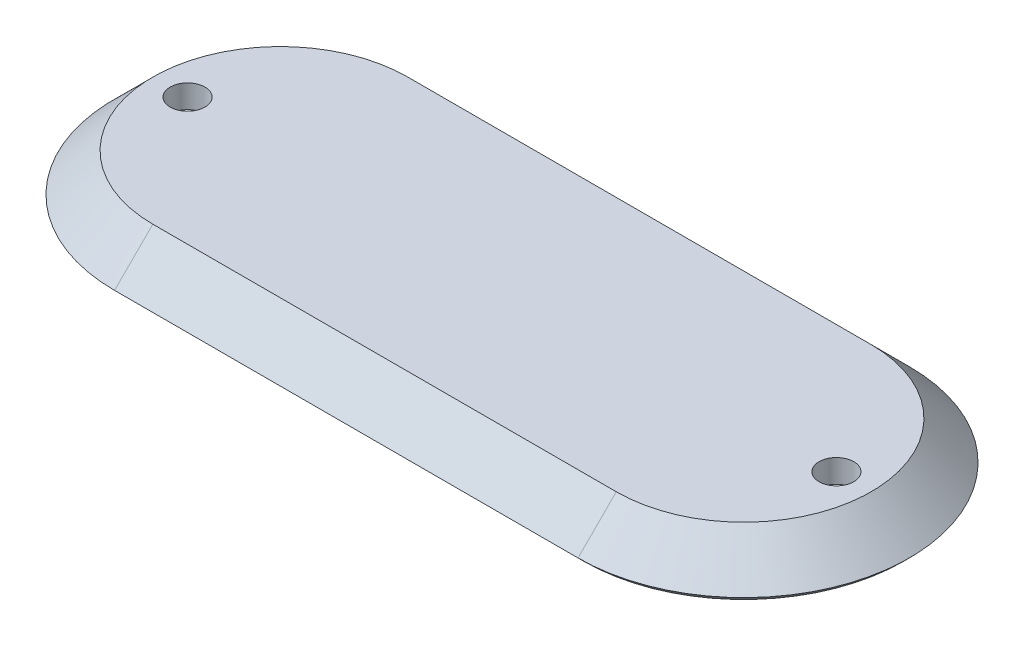
ISO-10303-21;
HEADER;
FILE_DESCRIPTION(('STEP AP214'),'2;1');
FILE_NAME('part.step','',(''),(''),'','','');
FILE_SCHEMA(('AUTOMOTIVE_DESIGN { 1 0 10303 214 1 1 1 1 }'));
ENDSEC;
DATA;
#1=APPLICATION_CONTEXT('core data for automotive mechanical design processes');
#2=APPLICATION_PROTOCOL_DEFINITION('international standard','automotive_design',2000,#1);
#3=PRODUCT_CONTEXT('',#1,'mechanical');
#4=PRODUCT('Part','Part','',(#3));
#5=PRODUCT_RELATED_PRODUCT_CATEGORY('part','',(#4));
#6=PRODUCT_DEFINITION_FORMATION('','',#4);
#7=PRODUCT_DEFINITION_CONTEXT('part definition',#1,'design');
#8=PRODUCT_DEFINITION('design','',#6,#7);
#9=PRODUCT_DEFINITION_SHAPE('','',#8);
#10=(LENGTH_UNIT() NAMED_UNIT(*) SI_UNIT(.MILLI.,.METRE.));
#11=(NAMED_UNIT(*) PLANE_ANGLE_UNIT() SI_UNIT($,.RADIAN.));
#12=(NAMED_UNIT(*) SI_UNIT($,.STERADIAN.) SOLID_ANGLE_UNIT());
#13=UNCERTAINTY_MEASURE_WITH_UNIT(LENGTH_MEASURE(1.E-05),#10,'distance_accuracy_value','');
#14=(GEOMETRIC_REPRESENTATION_CONTEXT(3) GLOBAL_UNCERTAINTY_ASSIGNED_CONTEXT((#13)) GLOBAL_UNIT_ASSIGNED_CONTEXT((#10,
#11,#12)) REPRESENTATION_CONTEXT('',''));
#15=CARTESIAN_POINT('',(0.,0.,0.));
#16=DIRECTION('',(0.,0.,1.));
#17=DIRECTION('',(1.,0.,0.));
#18=AXIS2_PLACEMENT_3D('',#15,#16,#17);
#19=CARTESIAN_POINT('',(-20.,0.,0.));
#20=DIRECTION('',(0.,-1.,0.));
#21=DIRECTION('',(0.,0.,1.));
#22=AXIS2_PLACEMENT_3D('',#19,#20,#21);
#23=CONICAL_SURFACE('',#22,14.8,0.78539816339745);
#24=DIRECTION('',(0.,-0.707106781186546,-0.707106781186549));
#25=VECTOR('',#24,1.);
#26=CARTESIAN_POINT('',(-20.,0.,-14.8));
#27=LINE('',#26,#25);
#28=CARTESIAN_POINT('',(-20.,3.8,-11.));
#29=VERTEX_POINT('',#28);
#30=CARTESIAN_POINT('',(-20.,0.500000000000007,-14.3));
#31=VERTEX_POINT('',#30);
#32=EDGE_CURVE('E166',#29,#31,#27,.T.);
#33=ORIENTED_EDGE('',*,*,#32,.T.);
#34=CARTESIAN_POINT('',(-20.,0.500000000000007,0.));
#35=DIRECTION('',(0.,1.,0.));
#36=DIRECTION('',(0.,0.,1.));
#37=AXIS2_PLACEMENT_3D('',#34,#35,#36);
#38=CIRCLE('',#37,14.3);
#39=CARTESIAN_POINT('',(-20.,0.500000000000011,14.3));
#40=VERTEX_POINT('',#39);
#41=EDGE_CURVE('E164',#31,#40,#38,.T.);
#42=ORIENTED_EDGE('',*,*,#41,.T.);
#43=DIRECTION('',(0.,-0.707106781186546,0.707106781186549));
#44=VECTOR('',#43,1.);
#45=CARTESIAN_POINT('',(-20.,0.,14.8));
#46=LINE('',#45,#44);
#47=CARTESIAN_POINT('',(-20.,3.8,11.));
#48=VERTEX_POINT('',#47);
#49=EDGE_CURVE('E162',#48,#40,#46,.T.);
#50=ORIENTED_EDGE('',*,*,#49,.F.);
#51=CARTESIAN_POINT('',(-20.,3.8,0.));
#52=DIRECTION('',(0.,1.,0.));
#53=DIRECTION('',(0.,0.,1.));
#54=AXIS2_PLACEMENT_3D('',#51,#52,#53);
#55=CIRCLE('',#54,11.);
#56=EDGE_CURVE('E137',#29,#48,#55,.T.);
#57=ORIENTED_EDGE('',*,*,#56,.F.);
#58=EDGE_LOOP('',(#33,#42,#50,#57));
#59=FACE_BOUND('',#58,.T.);
#60=ADVANCED_FACE('F33',(#59),#23,.T.);
#61=CARTESIAN_POINT('',(-20.,0.,14.8));
#62=DIRECTION('',(0.,0.707106781186549,0.707106781186546));
#63=DIRECTION('',(0.,-0.707106781186546,0.707106781186549));
#64=AXIS2_PLACEMENT_3D('',#61,#62,#63);
#65=PLANE('',#64);
#66=ORIENTED_EDGE('',*,*,#49,.T.);
#67=DIRECTION('',(-1.,0.,0.));
#68=VECTOR('',#67,1.);
#69=CARTESIAN_POINT('',(-20.,0.500000000000009,14.3));
#70=LINE('',#69,#68);
#71=CARTESIAN_POINT('',(20.,0.500000000000007,14.3));
#72=VERTEX_POINT('',#71);
#73=EDGE_CURVE('E56',#40,#72,#70,.F.);
#74=ORIENTED_EDGE('',*,*,#73,.T.);
#75=DIRECTION('',(0.,-0.707106781186546,0.707106781186549));
#76=VECTOR('',#75,1.);
#77=CARTESIAN_POINT('',(20.,0.,14.8));
#78=LINE('',#77,#76);
#79=CARTESIAN_POINT('',(20.,3.8,11.));
#80=VERTEX_POINT('',#79);
#81=EDGE_CURVE('E165',#80,#72,#78,.T.);
#82=ORIENTED_EDGE('',*,*,#81,.F.);
#83=DIRECTION('',(-1.,0.,0.));
#84=VECTOR('',#83,1.);
#85=CARTESIAN_POINT('',(-20.,3.8,11.));
#86=LINE('',#85,#84);
#87=EDGE_CURVE('E141',#48,#80,#86,.F.);
#88=ORIENTED_EDGE('',*,*,#87,.F.);
#89=EDGE_LOOP('',(#66,#74,#82,#88));
#90=FACE_BOUND('',#89,.T.);
#91=ADVANCED_FACE('F220',(#90),#65,.T.);
#92=CARTESIAN_POINT('',(20.,0.,0.));
#93=DIRECTION('',(0.,-1.,0.));
#94=DIRECTION('',(0.,0.,1.));
#95=AXIS2_PLACEMENT_3D('',#92,#93,#94);
#96=CONICAL_SURFACE('',#95,14.8,0.78539816339745);
#97=ORIENTED_EDGE('',*,*,#81,.T.);
#98=CARTESIAN_POINT('',(20.,0.500000000000007,0.));
#99=DIRECTION('',(0.,1.,0.));
#100=DIRECTION('',(0.,0.,1.));
#101=AXIS2_PLACEMENT_3D('',#98,#99,#100);
#102=CIRCLE('',#101,14.3);
#103=CARTESIAN_POINT('',(20.,0.500000000000007,-14.3));
#104=VERTEX_POINT('',#103);
#105=EDGE_CURVE('E11',#72,#104,#102,.T.);
#106=ORIENTED_EDGE('',*,*,#105,.T.);
#107=DIRECTION('',(0.,-0.707106781186546,-0.707106781186549));
#108=VECTOR('',#107,1.);
#109=CARTESIAN_POINT('',(20.,0.,-14.8));
#110=LINE('',#109,#108);
#111=CARTESIAN_POINT('',(20.,3.8,-11.));
#112=VERTEX_POINT('',#111);
#113=EDGE_CURVE('E169',#112,#104,#110,.T.);
#114=ORIENTED_EDGE('',*,*,#113,.F.);
#115=CARTESIAN_POINT('',(20.,3.8,0.));
#116=DIRECTION('',(0.,1.,0.));
#117=DIRECTION('',(0.,0.,1.));
#118=AXIS2_PLACEMENT_3D('',#115,#116,#117);
#119=CIRCLE('',#118,11.);
#120=EDGE_CURVE('E174',#80,#112,#119,.T.);
#121=ORIENTED_EDGE('',*,*,#120,.F.);
#122=EDGE_LOOP('',(#97,#106,#114,#121));
#123=FACE_BOUND('',#122,.T.);
#124=ADVANCED_FACE('F227',(#123),#96,.T.);
#125=CARTESIAN_POINT('',(-20.,0.,-14.8));
#126=DIRECTION('',(0.,0.707106781186549,-0.707106781186546));
#127=DIRECTION('',(0.,0.707106781186546,0.707106781186549));
#128=AXIS2_PLACEMENT_3D('',#125,#126,#127);
#129=PLANE('',#128);
#130=ORIENTED_EDGE('',*,*,#113,.T.);
#131=DIRECTION('',(1.,0.,0.));
#132=VECTOR('',#131,1.);
#133=CARTESIAN_POINT('',(-20.,0.500000000000009,-14.3));
#134=LINE('',#133,#132);
#135=EDGE_CURVE('E42',#104,#31,#134,.F.);
#136=ORIENTED_EDGE('',*,*,#135,.T.);
#137=ORIENTED_EDGE('',*,*,#32,.F.);
#138=DIRECTION('',(1.,0.,0.));
#139=VECTOR('',#138,1.);
#140=CARTESIAN_POINT('',(-20.,3.8,-11.));
#141=LINE('',#140,#139);
#142=EDGE_CURVE('E170',#112,#29,#141,.F.);
#143=ORIENTED_EDGE('',*,*,#142,.F.);
#144=EDGE_LOOP('',(#130,#136,#137,#143));
#145=FACE_BOUND('',#144,.T.);
#146=ADVANCED_FACE('F226',(#145),#129,.T.);
#147=CARTESIAN_POINT('',(-20.,3.8,0.));
#148=DIRECTION('',(0.,1.,0.));
#149=DIRECTION('',(0.,0.,1.));
#150=AXIS2_PLACEMENT_3D('',#147,#148,#149);
#151=PLANE('',#150);
#152=CARTESIAN_POINT('',(28.,3.8,0.));
#153=DIRECTION('',(0.,1.,0.));
#154=DIRECTION('',(0.,0.,-1.));
#155=AXIS2_PLACEMENT_3D('',#152,#153,#154);
#156=CIRCLE('',#155,1.5);
#157=CARTESIAN_POINT('',(28.,3.8,1.49999999999998));
#158=VERTEX_POINT('',#157);
#159=EDGE_CURVE('E273',#158,#158,#156,.T.);
#160=ORIENTED_EDGE('',*,*,#159,.F.);
#161=EDGE_LOOP('',(#160));
#162=FACE_BOUND('',#161,.T.);
#163=CARTESIAN_POINT('',(-28.,3.8,0.));
#164=DIRECTION('',(0.,1.,0.));
#165=DIRECTION('',(0.,0.,1.));
#166=AXIS2_PLACEMENT_3D('',#163,#164,#165);
#167=CIRCLE('',#166,1.5);
#168=CARTESIAN_POINT('',(-28.,3.8,1.5));
#169=VERTEX_POINT('',#168);
#170=EDGE_CURVE('E277',#169,#169,#167,.T.);
#171=ORIENTED_EDGE('',*,*,#170,.F.);
#172=EDGE_LOOP('',(#171));
#173=FACE_BOUND('',#172,.T.);
#174=ORIENTED_EDGE('',*,*,#56,.T.);
#175=ORIENTED_EDGE('',*,*,#87,.T.);
#176=ORIENTED_EDGE('',*,*,#120,.T.);
#177=ORIENTED_EDGE('',*,*,#142,.T.);
#178=EDGE_LOOP('',(#174,#175,#176,#177));
#179=FACE_BOUND('',#178,.T.);
#180=ADVANCED_FACE('F223',(#162,#173,#179),#151,.T.);
#181=CARTESIAN_POINT('',(-20.,0.,0.));
#182=DIRECTION('',(0.,1.,0.));
#183=DIRECTION('',(0.,0.,1.));
#184=AXIS2_PLACEMENT_3D('',#181,#182,#183);
#185=PLANE('',#184);
#186=DIRECTION('',(-1.,0.,0.));
#187=VECTOR('',#186,1.);
#188=CARTESIAN_POINT('',(-20.,0.,13.8));
#189=LINE('',#188,#187);
#190=CARTESIAN_POINT('',(20.,0.,13.8));
#191=VERTEX_POINT('',#190);
#192=CARTESIAN_POINT('',(-20.,0.,13.8));
#193=VERTEX_POINT('',#192);
#194=EDGE_CURVE('E183',#191,#193,#189,.T.);
#195=ORIENTED_EDGE('',*,*,#194,.T.);
#196=CARTESIAN_POINT('',(-20.,0.,0.));
#197=DIRECTION('',(0.,1.,0.));
#198=DIRECTION('',(0.,0.,1.));
#199=AXIS2_PLACEMENT_3D('',#196,#197,#198);
#200=CIRCLE('',#199,13.8);
#201=CARTESIAN_POINT('',(-20.,0.,-13.8));
#202=VERTEX_POINT('',#201);
#203=EDGE_CURVE('E185',#193,#202,#200,.F.);
#204=ORIENTED_EDGE('',*,*,#203,.T.);
#205=DIRECTION('',(1.,0.,0.));
#206=VECTOR('',#205,1.);
#207=CARTESIAN_POINT('',(-20.,0.,-13.8));
#208=LINE('',#207,#206);
#209=CARTESIAN_POINT('',(20.,0.,-13.8));
#210=VERTEX_POINT('',#209);
#211=EDGE_CURVE('E181',#202,#210,#208,.T.);
#212=ORIENTED_EDGE('',*,*,#211,.T.);
#213=CARTESIAN_POINT('',(20.,0.,0.));
#214=DIRECTION('',(0.,1.,0.));
#215=DIRECTION('',(0.,0.,1.));
#216=AXIS2_PLACEMENT_3D('',#213,#214,#215);
#217=CIRCLE('',#216,13.8);
#218=EDGE_CURVE('E179',#210,#191,#217,.F.);
#219=ORIENTED_EDGE('',*,*,#218,.T.);
#220=EDGE_LOOP('',(#195,#204,#212,#219));
#221=FACE_BOUND('',#220,.T.);
#222=DIRECTION('',(1.,0.,0.));
#223=VECTOR('',#222,1.);
#224=CARTESIAN_POINT('',(-20.,0.,-11.9715728752538));
#225=LINE('',#224,#223);
#226=CARTESIAN_POINT('',(20.,0.,-11.9715728752538));
#227=VERTEX_POINT('',#226);
#228=CARTESIAN_POINT('',(-20.,0.,-11.9715728752538));
#229=VERTEX_POINT('',#228);
#230=EDGE_CURVE('E132',#227,#229,#225,.F.);
#231=ORIENTED_EDGE('',*,*,#230,.T.);
#232=CARTESIAN_POINT('',(-20.,0.,0.));
#233=DIRECTION('',(0.,1.,0.));
#234=DIRECTION('',(0.,0.,1.));
#235=AXIS2_PLACEMENT_3D('',#232,#233,#234);
#236=CIRCLE('',#235,11.9715728752538);
#237=CARTESIAN_POINT('',(-20.,0.,11.9715728752538));
#238=VERTEX_POINT('',#237);
#239=EDGE_CURVE('E154',#229,#238,#236,.T.);
#240=ORIENTED_EDGE('',*,*,#239,.T.);
#241=DIRECTION('',(-1.,0.,0.));
#242=VECTOR('',#241,1.);
#243=CARTESIAN_POINT('',(-20.,0.,11.9715728752538));
#244=LINE('',#243,#242);
#245=CARTESIAN_POINT('',(20.,0.,11.9715728752538));
#246=VERTEX_POINT('',#245);
#247=EDGE_CURVE('E136',#238,#246,#244,.F.);
#248=ORIENTED_EDGE('',*,*,#247,.T.);
#249=CARTESIAN_POINT('',(20.,0.,0.));
#250=DIRECTION('',(0.,1.,0.));
#251=DIRECTION('',(0.,0.,1.));
#252=AXIS2_PLACEMENT_3D('',#249,#250,#251);
#253=CIRCLE('',#252,11.9715728752538);
#254=EDGE_CURVE('E158',#246,#227,#253,.T.);
#255=ORIENTED_EDGE('',*,*,#254,.T.);
#256=EDGE_LOOP('',(#231,#240,#248,#255));
#257=FACE_BOUND('',#256,.T.);
#258=ADVANCED_FACE('F208',(#221,#257),#185,.F.);
#259=CARTESIAN_POINT('',(-20.,-1.4142135623731,0.));
#260=DIRECTION('',(0.,-1.,0.));
#261=DIRECTION('',(0.,0.,1.));
#262=AXIS2_PLACEMENT_3D('',#259,#260,#261);
#263=CONICAL_SURFACE('',#262,13.3857864376269,0.78539816339745);
#264=ORIENTED_EDGE('',*,*,#239,.F.);
#265=DIRECTION('',(0.,-0.707106781186546,-0.707106781186549));
#266=VECTOR('',#265,1.);
#267=CARTESIAN_POINT('',(-20.,-1.4142135623731,-13.3857864376269));
#268=LINE('',#267,#266);
#269=CARTESIAN_POINT('',(-20.,1.8,-10.1715728752538));
#270=VERTEX_POINT('',#269);
#271=EDGE_CURVE('E131',#270,#229,#268,.T.);
#272=ORIENTED_EDGE('',*,*,#271,.F.);
#273=CARTESIAN_POINT('',(-20.,1.8,0.));
#274=DIRECTION('',(0.,1.,0.));
#275=DIRECTION('',(0.,0.,1.));
#276=AXIS2_PLACEMENT_3D('',#273,#274,#275);
#277=CIRCLE('',#276,10.1715728752538);
#278=CARTESIAN_POINT('',(-20.,1.8,10.1715728752538));
#279=VERTEX_POINT('',#278);
#280=EDGE_CURVE('E117',#270,#279,#277,.T.);
#281=ORIENTED_EDGE('',*,*,#280,.T.);
#282=DIRECTION('',(0.,-0.707106781186546,0.707106781186549));
#283=VECTOR('',#282,1.);
#284=CARTESIAN_POINT('',(-20.,-1.4142135623731,13.3857864376269));
#285=LINE('',#284,#283);
#286=EDGE_CURVE('E129',#279,#238,#285,.T.);
#287=ORIENTED_EDGE('',*,*,#286,.T.);
#288=EDGE_LOOP('',(#264,#272,#281,#287));
#289=FACE_BOUND('',#288,.T.);
#290=ADVANCED_FACE('F128',(#289),#263,.F.);
#291=CARTESIAN_POINT('',(-20.,-1.4142135623731,13.3857864376269));
#292=DIRECTION('',(0.,0.707106781186549,0.707106781186546));
#293=DIRECTION('',(0.,-0.707106781186546,0.707106781186549));
#294=AXIS2_PLACEMENT_3D('',#291,#292,#293);
#295=PLANE('',#294);
#296=ORIENTED_EDGE('',*,*,#247,.F.);
#297=ORIENTED_EDGE('',*,*,#286,.F.);
#298=DIRECTION('',(-1.,0.,0.));
#299=VECTOR('',#298,1.);
#300=CARTESIAN_POINT('',(-20.,1.8,10.1715728752538));
#301=LINE('',#300,#299);
#302=CARTESIAN_POINT('',(20.,1.8,10.1715728752538));
#303=VERTEX_POINT('',#302);
#304=EDGE_CURVE('E113',#279,#303,#301,.F.);
#305=ORIENTED_EDGE('',*,*,#304,.T.);
#306=DIRECTION('',(0.,-0.707106781186546,0.707106781186549));
#307=VECTOR('',#306,1.);
#308=CARTESIAN_POINT('',(20.,-1.4142135623731,13.3857864376269));
#309=LINE('',#308,#307);
#310=EDGE_CURVE('E138',#303,#246,#309,.T.);
#311=ORIENTED_EDGE('',*,*,#310,.T.);
#312=EDGE_LOOP('',(#296,#297,#305,#311));
#313=FACE_BOUND('',#312,.T.);
#314=ADVANCED_FACE('F134',(#313),#295,.F.);
#315=CARTESIAN_POINT('',(20.,-1.4142135623731,0.));
#316=DIRECTION('',(0.,-1.,0.));
#317=DIRECTION('',(0.,0.,1.));
#318=AXIS2_PLACEMENT_3D('',#315,#316,#317);
#319=CONICAL_SURFACE('',#318,13.3857864376269,0.78539816339745);
#320=ORIENTED_EDGE('',*,*,#254,.F.);
#321=ORIENTED_EDGE('',*,*,#310,.F.);
#322=CARTESIAN_POINT('',(20.,1.8,0.));
#323=DIRECTION('',(0.,1.,0.));
#324=DIRECTION('',(0.,0.,1.));
#325=AXIS2_PLACEMENT_3D('',#322,#323,#324);
#326=CIRCLE('',#325,10.1715728752538);
#327=CARTESIAN_POINT('',(20.,1.8,-10.1715728752538));
#328=VERTEX_POINT('',#327);
#329=EDGE_CURVE('E118',#303,#328,#326,.T.);
#330=ORIENTED_EDGE('',*,*,#329,.T.);
#331=DIRECTION('',(0.,0.707106781186546,0.707106781186549));
#332=VECTOR('',#331,1.);
#333=CARTESIAN_POINT('',(20.,-1.41421356237309,-13.3857864376269));
#334=LINE('',#333,#332);
#335=EDGE_CURVE('E143',#328,#227,#334,.F.);
#336=ORIENTED_EDGE('',*,*,#335,.T.);
#337=EDGE_LOOP('',(#320,#321,#330,#336));
#338=FACE_BOUND('',#337,.T.);
#339=ADVANCED_FACE('F252',(#338),#319,.F.);
#340=CARTESIAN_POINT('',(-20.,-1.4142135623731,-13.3857864376269));
#341=DIRECTION('',(0.,0.707106781186549,-0.707106781186546));
#342=DIRECTION('',(0.,0.707106781186546,0.707106781186549));
#343=AXIS2_PLACEMENT_3D('',#340,#341,#342);
#344=PLANE('',#343);
#345=ORIENTED_EDGE('',*,*,#230,.F.);
#346=ORIENTED_EDGE('',*,*,#335,.F.);
#347=DIRECTION('',(1.,0.,0.));
#348=VECTOR('',#347,1.);
#349=CARTESIAN_POINT('',(-20.,1.8,-10.1715728752538));
#350=LINE('',#349,#348);
#351=EDGE_CURVE('E149',#328,#270,#350,.F.);
#352=ORIENTED_EDGE('',*,*,#351,.T.);
#353=ORIENTED_EDGE('',*,*,#271,.T.);
#354=EDGE_LOOP('',(#345,#346,#352,#353));
#355=FACE_BOUND('',#354,.T.);
#356=ADVANCED_FACE('F248',(#355),#344,.F.);
#357=CARTESIAN_POINT('',(-20.,1.8,0.));
#358=DIRECTION('',(0.,1.,0.));
#359=DIRECTION('',(0.,0.,1.));
#360=AXIS2_PLACEMENT_3D('',#357,#358,#359);
#361=PLANE('',#360);
#362=CARTESIAN_POINT('',(28.,1.8,0.));
#363=DIRECTION('',(0.,1.,0.));
#364=DIRECTION('',(0.,0.,1.));
#365=AXIS2_PLACEMENT_3D('',#362,#363,#364);
#366=CIRCLE('',#365,1.5);
#367=CARTESIAN_POINT('',(28.,1.8,1.49999999999998));
#368=VERTEX_POINT('',#367);
#369=EDGE_CURVE('E276',#368,#368,#366,.F.);
#370=ORIENTED_EDGE('',*,*,#369,.F.);
#371=EDGE_LOOP('',(#370));
#372=FACE_BOUND('',#371,.T.);
#373=CARTESIAN_POINT('',(-28.,1.8,0.));
#374=DIRECTION('',(0.,1.,0.));
#375=DIRECTION('',(0.,0.,1.));
#376=AXIS2_PLACEMENT_3D('',#373,#374,#375);
#377=CIRCLE('',#376,1.5);
#378=CARTESIAN_POINT('',(-28.,1.8,1.5));
#379=VERTEX_POINT('',#378);
#380=EDGE_CURVE('E146',#379,#379,#377,.F.);
#381=ORIENTED_EDGE('',*,*,#380,.F.);
#382=EDGE_LOOP('',(#381));
#383=FACE_BOUND('',#382,.T.);
#384=ORIENTED_EDGE('',*,*,#280,.F.);
#385=ORIENTED_EDGE('',*,*,#351,.F.);
#386=ORIENTED_EDGE('',*,*,#329,.F.);
#387=ORIENTED_EDGE('',*,*,#304,.F.);
#388=EDGE_LOOP('',(#384,#385,#386,#387));
#389=FACE_BOUND('',#388,.T.);
#390=ADVANCED_FACE('F115',(#372,#383,#389),#361,.F.);
#391=CARTESIAN_POINT('',(20.,0.500000000000009,0.));
#392=DIRECTION('',(0.,1.,0.));
#393=DIRECTION('',(0.,0.,1.));
#394=AXIS2_PLACEMENT_3D('',#391,#392,#393);
#395=CONICAL_SURFACE('',#394,14.3,0.785398163397441);
#396=DIRECTION('',(0.,0.707106781186553,0.707106781186543));
#397=VECTOR('',#396,1.);
#398=CARTESIAN_POINT('',(20.,0.,13.8));
#399=LINE('',#398,#397);
#400=EDGE_CURVE('E193',#191,#72,#399,.T.);
#401=ORIENTED_EDGE('',*,*,#400,.F.);
#402=ORIENTED_EDGE('',*,*,#218,.F.);
#403=DIRECTION('',(0.,-0.707106781186552,0.707106781186543));
#404=VECTOR('',#403,1.);
#405=CARTESIAN_POINT('',(20.,0.500000000000009,-14.3));
#406=LINE('',#405,#404);
#407=EDGE_CURVE('E37',#104,#210,#406,.T.);
#408=ORIENTED_EDGE('',*,*,#407,.F.);
#409=ORIENTED_EDGE('',*,*,#105,.F.);
#410=EDGE_LOOP('',(#401,#402,#408,#409));
#411=FACE_BOUND('',#410,.T.);
#412=ADVANCED_FACE('F35',(#411),#395,.T.);
#413=CARTESIAN_POINT('',(-20.,0.500000000000009,-14.3));
#414=DIRECTION('',(0.,-0.707106781186542,-0.707106781186553));
#415=DIRECTION('',(1.,0.,0.));
#416=AXIS2_PLACEMENT_3D('',#413,#414,#415);
#417=PLANE('',#416);
#418=ORIENTED_EDGE('',*,*,#407,.T.);
#419=ORIENTED_EDGE('',*,*,#211,.F.);
#420=DIRECTION('',(0.,-0.707106781186552,0.707106781186543));
#421=VECTOR('',#420,1.);
#422=CARTESIAN_POINT('',(-20.,0.500000000000009,-14.3));
#423=LINE('',#422,#421);
#424=EDGE_CURVE('E192',#31,#202,#423,.T.);
#425=ORIENTED_EDGE('',*,*,#424,.F.);
#426=ORIENTED_EDGE('',*,*,#135,.F.);
#427=EDGE_LOOP('',(#418,#419,#425,#426));
#428=FACE_BOUND('',#427,.T.);
#429=ADVANCED_FACE('F203',(#428),#417,.T.);
#430=CARTESIAN_POINT('',(-20.,0.500000000000009,14.3));
#431=DIRECTION('',(0.,-0.707106781186542,0.707106781186553));
#432=DIRECTION('',(-1.,0.,0.));
#433=AXIS2_PLACEMENT_3D('',#430,#431,#432);
#434=PLANE('',#433);
#435=ORIENTED_EDGE('',*,*,#400,.T.);
#436=ORIENTED_EDGE('',*,*,#73,.F.);
#437=DIRECTION('',(0.,0.707106781186552,0.707106781186543));
#438=VECTOR('',#437,1.);
#439=CARTESIAN_POINT('',(-20.,0.,13.8));
#440=LINE('',#439,#438);
#441=EDGE_CURVE('E190',#193,#40,#440,.T.);
#442=ORIENTED_EDGE('',*,*,#441,.F.);
#443=ORIENTED_EDGE('',*,*,#194,.F.);
#444=EDGE_LOOP('',(#435,#436,#442,#443));
#445=FACE_BOUND('',#444,.T.);
#446=ADVANCED_FACE('F215',(#445),#434,.T.);
#447=CARTESIAN_POINT('',(-20.,0.500000000000009,0.));
#448=DIRECTION('',(0.,1.,0.));
#449=DIRECTION('',(0.,0.,1.));
#450=AXIS2_PLACEMENT_3D('',#447,#448,#449);
#451=CONICAL_SURFACE('',#450,14.3,0.785398163397441);
#452=ORIENTED_EDGE('',*,*,#424,.T.);
#453=ORIENTED_EDGE('',*,*,#203,.F.);
#454=ORIENTED_EDGE('',*,*,#441,.T.);
#455=ORIENTED_EDGE('',*,*,#41,.F.);
#456=EDGE_LOOP('',(#452,#453,#454,#455));
#457=FACE_BOUND('',#456,.T.);
#458=ADVANCED_FACE('F213',(#457),#451,.T.);
#459=CARTESIAN_POINT('',(-28.,-0.00100000000000013,0.));
#460=DIRECTION('',(0.,1.,0.));
#461=DIRECTION('',(0.,0.,1.));
#462=AXIS2_PLACEMENT_3D('',#459,#460,#461);
#463=CYLINDRICAL_SURFACE('',#462,1.5);
#464=CARTESIAN_POINT('',(-28.,3.8,1.5));
#465=CARTESIAN_POINT('',(-28.,3.77916666666667,1.5));
#466=CARTESIAN_POINT('',(-28.,3.75833333333333,1.5));
#467=CARTESIAN_POINT('',(-28.,3.71666666666667,1.5));
#468=CARTESIAN_POINT('',(-28.,3.69583333333333,1.5));
#469=CARTESIAN_POINT('',(-28.,3.65416666666667,1.5));
#470=CARTESIAN_POINT('',(-28.,3.63333333333333,1.5));
#471=CARTESIAN_POINT('',(-28.,3.59166666666667,1.5));
#472=CARTESIAN_POINT('',(-28.,3.57083333333333,1.5));
#473=CARTESIAN_POINT('',(-28.,3.52916666666667,1.5));
#474=CARTESIAN_POINT('',(-28.,3.50833333333333,1.5));
#475=CARTESIAN_POINT('',(-28.,3.46666666666667,1.5));
#476=CARTESIAN_POINT('',(-28.,3.44583333333333,1.5));
#477=CARTESIAN_POINT('',(-28.,3.40416666666667,1.5));
#478=CARTESIAN_POINT('',(-28.,3.38333333333333,1.5));
#479=CARTESIAN_POINT('',(-28.,3.34166666666667,1.5));
#480=CARTESIAN_POINT('',(-28.,3.32083333333333,1.5));
#481=CARTESIAN_POINT('',(-28.,3.27916666666667,1.5));
#482=CARTESIAN_POINT('',(-28.,3.25833333333333,1.5));
#483=CARTESIAN_POINT('',(-28.,3.21666666666667,1.5));
#484=CARTESIAN_POINT('',(-28.,3.19583333333333,1.5));
#485=CARTESIAN_POINT('',(-28.,3.15416666666667,1.5));
#486=CARTESIAN_POINT('',(-28.,3.13333333333333,1.5));
#487=CARTESIAN_POINT('',(-28.,3.09166666666667,1.5));
#488=CARTESIAN_POINT('',(-28.,3.07083333333333,1.5));
#489=CARTESIAN_POINT('',(-28.,3.02916666666667,1.5));
#490=CARTESIAN_POINT('',(-28.,3.00833333333333,1.5));
#491=CARTESIAN_POINT('',(-28.,2.96666666666667,1.5));
#492=CARTESIAN_POINT('',(-28.,2.94583333333333,1.5));
#493=CARTESIAN_POINT('',(-28.,2.90416666666667,1.5));
#494=CARTESIAN_POINT('',(-28.,2.88333333333333,1.5));
#495=CARTESIAN_POINT('',(-28.,2.84166666666667,1.5));
#496=CARTESIAN_POINT('',(-28.,2.82083333333333,1.5));
#497=CARTESIAN_POINT('',(-28.,2.77916666666667,1.5));
#498=CARTESIAN_POINT('',(-28.,2.75833333333333,1.5));
#499=CARTESIAN_POINT('',(-28.,2.71666666666667,1.5));
#500=CARTESIAN_POINT('',(-28.,2.69583333333333,1.5));
#501=CARTESIAN_POINT('',(-28.,2.65416666666667,1.5));
#502=CARTESIAN_POINT('',(-28.,2.63333333333333,1.5));
#503=CARTESIAN_POINT('',(-28.,2.59166666666667,1.5));
#504=CARTESIAN_POINT('',(-28.,2.57083333333333,1.5));
#505=CARTESIAN_POINT('',(-28.,2.52916666666667,1.5));
#506=CARTESIAN_POINT('',(-28.,2.50833333333333,1.5));
#507=CARTESIAN_POINT('',(-28.,2.46666666666667,1.5));
#508=CARTESIAN_POINT('',(-28.,2.44583333333333,1.5));
#509=CARTESIAN_POINT('',(-28.,2.40416666666667,1.5));
#510=CARTESIAN_POINT('',(-28.,2.38333333333333,1.5));
#511=CARTESIAN_POINT('',(-28.,2.34166666666667,1.5));
#512=CARTESIAN_POINT('',(-28.,2.32083333333333,1.5));
#513=CARTESIAN_POINT('',(-28.,2.27916666666667,1.5));
#514=CARTESIAN_POINT('',(-28.,2.25833333333333,1.5));
#515=CARTESIAN_POINT('',(-28.,2.21666666666667,1.5));
#516=CARTESIAN_POINT('',(-28.,2.19583333333333,1.5));
#517=CARTESIAN_POINT('',(-28.,2.15416666666667,1.5));
#518=CARTESIAN_POINT('',(-28.,2.13333333333333,1.5));
#519=CARTESIAN_POINT('',(-28.,2.09166666666667,1.5));
#520=CARTESIAN_POINT('',(-28.,2.07083333333333,1.5));
#521=CARTESIAN_POINT('',(-28.,2.02916666666667,1.5));
#522=CARTESIAN_POINT('',(-28.,2.00833333333333,1.5));
#523=CARTESIAN_POINT('',(-28.,1.96666666666667,1.5));
#524=CARTESIAN_POINT('',(-28.,1.94583333333333,1.5));
#525=CARTESIAN_POINT('',(-28.,1.90416666666667,1.5));
#526=CARTESIAN_POINT('',(-28.,1.88333333333333,1.5));
#527=CARTESIAN_POINT('',(-28.,1.84166666666667,1.5));
#528=CARTESIAN_POINT('',(-28.,1.82083333333333,1.5));
#529=CARTESIAN_POINT('',(-28.,1.8,1.5));
#530=B_SPLINE_CURVE_WITH_KNOTS('',3,(#464,#465,#466,#467,#468,#469,#470,#471,#472,#473,#474,
#475,#476,#477,#478,#479,#480,#481,#482,#483,#484,#485,#486,#487,#488,#489,#490,#491,#492,#493,
#494,#495,#496,#497,#498,#499,#500,#501,#502,#503,#504,#505,#506,#507,#508,#509,#510,#511,#512,
#513,#514,#515,#516,#517,#518,#519,#520,#521,#522,#523,#524,#525,#526,#527,#528,#529),
.UNSPECIFIED.,.F.,.F.,(4,2,2,2,2,2,2,2,2,2,2,2,2,2,2,2,2,2,2,2,2,2,2,2,2,2,2,2,2,2,2,2,4),(0.,
0.0625000000000001,0.125,0.1875,0.25,0.3125,0.375,0.4375,0.5,0.5625,0.625,0.6875,0.75,0.8125,
0.875,0.9375,1.,1.0625,1.125,1.1875,1.25,1.3125,1.375,1.4375,1.5,1.5625,1.625,1.6875,1.75,
1.8125,1.875,1.9375,2.),.UNSPECIFIED.);
#531=EDGE_CURVE('BSEAM261',#169,#379,#530,.T.);
#532=ORIENTED_EDGE('',*,*,#170,.T.);
#533=ORIENTED_EDGE('',*,*,#380,.T.);
#534=ORIENTED_EDGE('',*,*,#531,.T.);
#535=ORIENTED_EDGE('',*,*,#531,.F.);
#536=EDGE_LOOP('',(#532,#534,#533,#535));
#537=FACE_BOUND('',#536,.T.);
#538=ADVANCED_FACE('F261',(#537),#463,.F.);
#539=CARTESIAN_POINT('',(28.,-0.00100000000000013,0.));
#540=DIRECTION('',(0.,1.,0.));
#541=DIRECTION('',(0.,0.,1.));
#542=AXIS2_PLACEMENT_3D('',#539,#540,#541);
#543=CYLINDRICAL_SURFACE('',#542,1.5);
#544=CARTESIAN_POINT('',(28.,3.8,1.49999999999998));
#545=CARTESIAN_POINT('',(28.,3.77916666666667,1.49999999999998));
#546=CARTESIAN_POINT('',(28.,3.75833333333333,1.49999999999998));
#547=CARTESIAN_POINT('',(28.,3.71666666666667,1.49999999999998));
#548=CARTESIAN_POINT('',(28.,3.69583333333333,1.49999999999998));
#549=CARTESIAN_POINT('',(28.,3.65416666666667,1.49999999999998));
#550=CARTESIAN_POINT('',(28.,3.63333333333333,1.49999999999998));
#551=CARTESIAN_POINT('',(28.,3.59166666666667,1.49999999999998));
#552=CARTESIAN_POINT('',(28.,3.57083333333333,1.49999999999998));
#553=CARTESIAN_POINT('',(28.,3.52916666666667,1.49999999999998));
#554=CARTESIAN_POINT('',(28.,3.50833333333333,1.49999999999998));
#555=CARTESIAN_POINT('',(28.,3.46666666666667,1.49999999999998));
#556=CARTESIAN_POINT('',(28.,3.44583333333333,1.49999999999998));
#557=CARTESIAN_POINT('',(28.,3.40416666666667,1.49999999999998));
#558=CARTESIAN_POINT('',(28.,3.38333333333333,1.49999999999998));
#559=CARTESIAN_POINT('',(28.,3.34166666666667,1.49999999999998));
#560=CARTESIAN_POINT('',(28.,3.32083333333333,1.49999999999998));
#561=CARTESIAN_POINT('',(28.,3.27916666666667,1.49999999999998));
#562=CARTESIAN_POINT('',(28.,3.25833333333333,1.49999999999998));
#563=CARTESIAN_POINT('',(28.,3.21666666666667,1.49999999999998));
#564=CARTESIAN_POINT('',(28.,3.19583333333333,1.49999999999998));
#565=CARTESIAN_POINT('',(28.,3.15416666666667,1.49999999999998));
#566=CARTESIAN_POINT('',(28.,3.13333333333333,1.49999999999998));
#567=CARTESIAN_POINT('',(28.,3.09166666666667,1.49999999999998));
#568=CARTESIAN_POINT('',(28.,3.07083333333333,1.49999999999998));
#569=CARTESIAN_POINT('',(28.,3.02916666666667,1.49999999999998));
#570=CARTESIAN_POINT('',(28.,3.00833333333333,1.49999999999998));
#571=CARTESIAN_POINT('',(28.,2.96666666666667,1.49999999999998));
#572=CARTESIAN_POINT('',(28.,2.94583333333333,1.49999999999998));
#573=CARTESIAN_POINT('',(28.,2.90416666666667,1.49999999999998));
#574=CARTESIAN_POINT('',(28.,2.88333333333333,1.49999999999998));
#575=CARTESIAN_POINT('',(28.,2.84166666666667,1.49999999999998));
#576=CARTESIAN_POINT('',(28.,2.82083333333333,1.49999999999998));
#577=CARTESIAN_POINT('',(28.,2.77916666666667,1.49999999999998));
#578=CARTESIAN_POINT('',(28.,2.75833333333333,1.49999999999998));
#579=CARTESIAN_POINT('',(28.,2.71666666666667,1.49999999999998));
#580=CARTESIAN_POINT('',(28.,2.69583333333333,1.49999999999998));
#581=CARTESIAN_POINT('',(28.,2.65416666666667,1.49999999999998));
#582=CARTESIAN_POINT('',(28.,2.63333333333333,1.49999999999998));
#583=CARTESIAN_POINT('',(28.,2.59166666666667,1.49999999999998));
#584=CARTESIAN_POINT('',(28.,2.57083333333333,1.49999999999998));
#585=CARTESIAN_POINT('',(28.,2.52916666666667,1.49999999999998));
#586=CARTESIAN_POINT('',(28.,2.50833333333333,1.49999999999998));
#587=CARTESIAN_POINT('',(28.,2.46666666666667,1.49999999999998));
#588=CARTESIAN_POINT('',(28.,2.44583333333333,1.49999999999998));
#589=CARTESIAN_POINT('',(28.,2.40416666666667,1.49999999999998));
#590=CARTESIAN_POINT('',(28.,2.38333333333333,1.49999999999998));
#591=CARTESIAN_POINT('',(28.,2.34166666666667,1.49999999999998));
#592=CARTESIAN_POINT('',(28.,2.32083333333333,1.49999999999998));
#593=CARTESIAN_POINT('',(28.,2.27916666666667,1.49999999999998));
#594=CARTESIAN_POINT('',(28.,2.25833333333333,1.49999999999998));
#595=CARTESIAN_POINT('',(28.,2.21666666666667,1.49999999999998));
#596=CARTESIAN_POINT('',(28.,2.19583333333333,1.49999999999998));
#597=CARTESIAN_POINT('',(28.,2.15416666666667,1.49999999999998));
#598=CARTESIAN_POINT('',(28.,2.13333333333333,1.49999999999998));
#599=CARTESIAN_POINT('',(28.,2.09166666666667,1.49999999999998));
#600=CARTESIAN_POINT('',(28.,2.07083333333333,1.49999999999998));
#601=CARTESIAN_POINT('',(28.,2.02916666666667,1.49999999999998));
#602=CARTESIAN_POINT('',(28.,2.00833333333333,1.49999999999998));
#603=CARTESIAN_POINT('',(28.,1.96666666666667,1.49999999999998));
#604=CARTESIAN_POINT('',(28.,1.94583333333333,1.49999999999998));
#605=CARTESIAN_POINT('',(28.,1.90416666666667,1.49999999999998));
#606=CARTESIAN_POINT('',(28.,1.88333333333333,1.49999999999998));
#607=CARTESIAN_POINT('',(28.,1.84166666666667,1.49999999999998));
#608=CARTESIAN_POINT('',(28.,1.82083333333333,1.49999999999998));
#609=CARTESIAN_POINT('',(28.,1.8,1.49999999999998));
#610=B_SPLINE_CURVE_WITH_KNOTS('',3,(#544,#545,#546,#547,#548,#549,#550,#551,#552,#553,#554,
#555,#556,#557,#558,#559,#560,#561,#562,#563,#564,#565,#566,#567,#568,#569,#570,#571,#572,#573,
#574,#575,#576,#577,#578,#579,#580,#581,#582,#583,#584,#585,#586,#587,#588,#589,#590,#591,#592,
#593,#594,#595,#596,#597,#598,#599,#600,#601,#602,#603,#604,#605,#606,#607,#608,#609),
.UNSPECIFIED.,.F.,.F.,(4,2,2,2,2,2,2,2,2,2,2,2,2,2,2,2,2,2,2,2,2,2,2,2,2,2,2,2,2,2,2,2,4),(0.,
0.0625000000000001,0.125,0.1875,0.25,0.3125,0.375,0.4375,0.5,0.5625,0.625,0.6875,0.75,0.8125,
0.875,0.9375,1.,1.0625,1.125,1.1875,1.25,1.3125,1.375,1.4375,1.5,1.5625,1.625,1.6875,1.75,
1.8125,1.875,1.9375,2.),.UNSPECIFIED.);
#611=EDGE_CURVE('BSEAM264',#158,#368,#610,.T.);
#612=ORIENTED_EDGE('',*,*,#159,.T.);
#613=ORIENTED_EDGE('',*,*,#369,.T.);
#614=ORIENTED_EDGE('',*,*,#611,.T.);
#615=ORIENTED_EDGE('',*,*,#611,.F.);
#616=EDGE_LOOP('',(#612,#614,#613,#615));
#617=FACE_BOUND('',#616,.T.);
#618=ADVANCED_FACE('F264',(#617),#543,.F.);
#619=CLOSED_SHELL('',(#60,#91,#124,#146,#180,#258,#290,#314,#339,#356,#390,#412,#429,#446,#458,
#538,#618));
#620=MANIFOLD_SOLID_BREP('B2',#619);
#621=ADVANCED_BREP_SHAPE_REPRESENTATION('',(#18,#620),#14);
#622=SHAPE_DEFINITION_REPRESENTATION(#9,#621);
ENDSEC;
END-ISO-10303-21;
